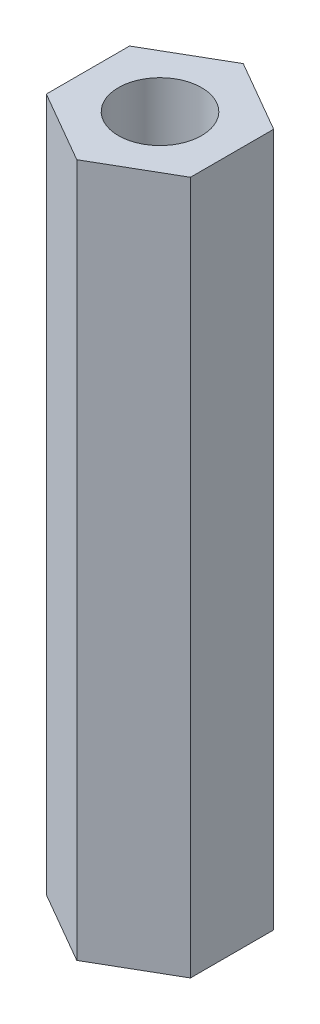
ISO-10303-21;
HEADER;
FILE_DESCRIPTION(('STEP AP214'),'2;1');
FILE_NAME('part.step','',(''),(''),'','','');
FILE_SCHEMA(('AUTOMOTIVE_DESIGN { 1 0 10303 214 1 1 1 1 }'));
ENDSEC;
DATA;
#1=APPLICATION_CONTEXT('core data for automotive mechanical design processes');
#2=APPLICATION_PROTOCOL_DEFINITION('international standard','automotive_design',2000,#1);
#3=PRODUCT_CONTEXT('',#1,'mechanical');
#4=PRODUCT('Part','Part','',(#3));
#5=PRODUCT_RELATED_PRODUCT_CATEGORY('part','',(#4));
#6=PRODUCT_DEFINITION_FORMATION('','',#4);
#7=PRODUCT_DEFINITION_CONTEXT('part definition',#1,'design');
#8=PRODUCT_DEFINITION('design','',#6,#7);
#9=PRODUCT_DEFINITION_SHAPE('','',#8);
#10=(LENGTH_UNIT() NAMED_UNIT(*) SI_UNIT(.MILLI.,.METRE.));
#11=(NAMED_UNIT(*) PLANE_ANGLE_UNIT() SI_UNIT($,.RADIAN.));
#12=(NAMED_UNIT(*) SI_UNIT($,.STERADIAN.) SOLID_ANGLE_UNIT());
#13=UNCERTAINTY_MEASURE_WITH_UNIT(LENGTH_MEASURE(1.E-05),#10,'distance_accuracy_value','');
#14=(GEOMETRIC_REPRESENTATION_CONTEXT(3) GLOBAL_UNCERTAINTY_ASSIGNED_CONTEXT((#13)) GLOBAL_UNIT_ASSIGNED_CONTEXT((#10,
#11,#12)) REPRESENTATION_CONTEXT('',''));
#15=CARTESIAN_POINT('',(0.,0.,0.));
#16=DIRECTION('',(0.,0.,1.));
#17=DIRECTION('',(1.,0.,0.));
#18=AXIS2_PLACEMENT_3D('',#15,#16,#17);
#19=CARTESIAN_POINT('',(0.,25.,0.));
#20=DIRECTION('',(0.,1.,0.));
#21=DIRECTION('',(0.,0.,1.));
#22=AXIS2_PLACEMENT_3D('',#19,#20,#21);
#23=PLANE('',#22);
#24=DIRECTION('',(-0.866025403784439,0.,-0.499999999999999));
#25=VECTOR('',#24,1.);
#26=CARTESIAN_POINT('',(2.59807621135331,25.,-1.50000000000001));
#27=LINE('',#26,#25);
#28=CARTESIAN_POINT('',(2.59807621135331,25.,-1.50000000000001));
#29=VERTEX_POINT('',#28);
#30=CARTESIAN_POINT('',(0.,25.,-3.));
#31=VERTEX_POINT('',#30);
#32=EDGE_CURVE('E130',#29,#31,#27,.T.);
#33=ORIENTED_EDGE('',*,*,#32,.T.);
#34=DIRECTION('',(-0.866025403784439,0.,0.499999999999999));
#35=VECTOR('',#34,1.);
#36=CARTESIAN_POINT('',(0.,25.,-3.));
#37=LINE('',#36,#35);
#38=CARTESIAN_POINT('',(-2.59807621135331,25.,-1.5));
#39=VERTEX_POINT('',#38);
#40=EDGE_CURVE('E88',#31,#39,#37,.T.);
#41=ORIENTED_EDGE('',*,*,#40,.T.);
#42=DIRECTION('',(0.,0.,1.));
#43=VECTOR('',#42,1.);
#44=CARTESIAN_POINT('',(-2.59807621135331,25.,-1.5));
#45=LINE('',#44,#43);
#46=CARTESIAN_POINT('',(-2.59807621135331,25.,1.50000000000001));
#47=VERTEX_POINT('',#46);
#48=EDGE_CURVE('E101',#39,#47,#45,.T.);
#49=ORIENTED_EDGE('',*,*,#48,.T.);
#50=DIRECTION('',(0.866025403784439,0.,0.499999999999999));
#51=VECTOR('',#50,1.);
#52=CARTESIAN_POINT('',(-2.59807621135331,25.,1.50000000000001));
#53=LINE('',#52,#51);
#54=CARTESIAN_POINT('',(0.,25.,3.));
#55=VERTEX_POINT('',#54);
#56=EDGE_CURVE('E95',#47,#55,#53,.T.);
#57=ORIENTED_EDGE('',*,*,#56,.T.);
#58=DIRECTION('',(0.866025403784439,0.,-0.499999999999999));
#59=VECTOR('',#58,1.);
#60=CARTESIAN_POINT('',(0.,25.,3.));
#61=LINE('',#60,#59);
#62=CARTESIAN_POINT('',(2.59807621135331,25.,1.5));
#63=VERTEX_POINT('',#62);
#64=EDGE_CURVE('E99',#55,#63,#61,.T.);
#65=ORIENTED_EDGE('',*,*,#64,.T.);
#66=DIRECTION('',(0.,0.,-1.));
#67=VECTOR('',#66,1.);
#68=CARTESIAN_POINT('',(2.59807621135331,25.,1.5));
#69=LINE('',#68,#67);
#70=EDGE_CURVE('E51',#63,#29,#69,.T.);
#71=ORIENTED_EDGE('',*,*,#70,.T.);
#72=EDGE_LOOP('',(#33,#41,#49,#57,#65,#71));
#73=FACE_BOUND('',#72,.T.);
#74=CARTESIAN_POINT('',(0.,25.,0.));
#75=DIRECTION('',(0.,1.,0.));
#76=DIRECTION('',(0.,0.,1.));
#77=AXIS2_PLACEMENT_3D('',#74,#75,#76);
#78=CIRCLE('',#77,1.5);
#79=CARTESIAN_POINT('',(0.,25.,1.5));
#80=VERTEX_POINT('',#79);
#81=EDGE_CURVE('E123',#80,#80,#78,.T.);
#82=ORIENTED_EDGE('',*,*,#81,.F.);
#83=EDGE_LOOP('',(#82));
#84=FACE_BOUND('',#83,.T.);
#85=ADVANCED_FACE('F34',(#73,#84),#23,.T.);
#86=CARTESIAN_POINT('',(0.,0.,0.));
#87=DIRECTION('',(0.,1.,0.));
#88=DIRECTION('',(0.,0.,1.));
#89=AXIS2_PLACEMENT_3D('',#86,#87,#88);
#90=PLANE('',#89);
#91=DIRECTION('',(-0.866025403784439,0.,-0.499999999999999));
#92=VECTOR('',#91,1.);
#93=CARTESIAN_POINT('',(2.59807621135331,0.,-1.50000000000001));
#94=LINE('',#93,#92);
#95=CARTESIAN_POINT('',(2.59807621135331,0.,-1.50000000000001));
#96=VERTEX_POINT('',#95);
#97=CARTESIAN_POINT('',(0.,0.,-3.));
#98=VERTEX_POINT('',#97);
#99=EDGE_CURVE('E119',#96,#98,#94,.T.);
#100=ORIENTED_EDGE('',*,*,#99,.F.);
#101=DIRECTION('',(0.,0.,-1.));
#102=VECTOR('',#101,1.);
#103=CARTESIAN_POINT('',(2.59807621135331,0.,1.5));
#104=LINE('',#103,#102);
#105=CARTESIAN_POINT('',(2.59807621135331,0.,1.5));
#106=VERTEX_POINT('',#105);
#107=EDGE_CURVE('E80',#106,#96,#104,.T.);
#108=ORIENTED_EDGE('',*,*,#107,.F.);
#109=DIRECTION('',(0.866025403784439,0.,-0.499999999999999));
#110=VECTOR('',#109,1.);
#111=CARTESIAN_POINT('',(0.,0.,3.));
#112=LINE('',#111,#110);
#113=CARTESIAN_POINT('',(0.,0.,3.));
#114=VERTEX_POINT('',#113);
#115=EDGE_CURVE('E74',#114,#106,#112,.T.);
#116=ORIENTED_EDGE('',*,*,#115,.F.);
#117=DIRECTION('',(0.866025403784439,0.,0.499999999999999));
#118=VECTOR('',#117,1.);
#119=CARTESIAN_POINT('',(-2.59807621135331,0.,1.50000000000001));
#120=LINE('',#119,#118);
#121=CARTESIAN_POINT('',(-2.59807621135331,0.,1.50000000000001));
#122=VERTEX_POINT('',#121);
#123=EDGE_CURVE('E109',#122,#114,#120,.T.);
#124=ORIENTED_EDGE('',*,*,#123,.F.);
#125=DIRECTION('',(0.,0.,1.));
#126=VECTOR('',#125,1.);
#127=CARTESIAN_POINT('',(-2.59807621135331,0.,-1.5));
#128=LINE('',#127,#126);
#129=CARTESIAN_POINT('',(-2.59807621135331,0.,-1.5));
#130=VERTEX_POINT('',#129);
#131=EDGE_CURVE('E125',#130,#122,#128,.T.);
#132=ORIENTED_EDGE('',*,*,#131,.F.);
#133=DIRECTION('',(-0.866025403784439,0.,0.499999999999999));
#134=VECTOR('',#133,1.);
#135=CARTESIAN_POINT('',(0.,0.,-3.));
#136=LINE('',#135,#134);
#137=EDGE_CURVE('E122',#98,#130,#136,.T.);
#138=ORIENTED_EDGE('',*,*,#137,.F.);
#139=EDGE_LOOP('',(#100,#108,#116,#124,#132,#138));
#140=FACE_BOUND('',#139,.T.);
#141=CARTESIAN_POINT('',(0.,0.,0.));
#142=DIRECTION('',(0.,1.,0.));
#143=DIRECTION('',(0.,0.,1.));
#144=AXIS2_PLACEMENT_3D('',#141,#142,#143);
#145=CIRCLE('',#144,1.5);
#146=CARTESIAN_POINT('',(0.,0.,1.5));
#147=VERTEX_POINT('',#146);
#148=EDGE_CURVE('E223',#147,#147,#145,.T.);
#149=ORIENTED_EDGE('',*,*,#148,.T.);
#150=EDGE_LOOP('',(#149));
#151=FACE_BOUND('',#150,.T.);
#152=ADVANCED_FACE('F139',(#140,#151),#90,.F.);
#153=CARTESIAN_POINT('',(2.59807621135331,25.,-1.50000000000001));
#154=DIRECTION('',(-0.499999999999999,0.,0.866025403784439));
#155=DIRECTION('',(0.866025403784439,0.,0.499999999999999));
#156=AXIS2_PLACEMENT_3D('',#153,#154,#155);
#157=PLANE('',#156);
#158=ORIENTED_EDGE('',*,*,#99,.T.);
#159=DIRECTION('',(0.,-1.,0.));
#160=VECTOR('',#159,1.);
#161=CARTESIAN_POINT('',(0.,25.,-3.));
#162=LINE('',#161,#160);
#163=EDGE_CURVE('E11',#31,#98,#162,.T.);
#164=ORIENTED_EDGE('',*,*,#163,.F.);
#165=ORIENTED_EDGE('',*,*,#32,.F.);
#166=DIRECTION('',(0.,-1.,0.));
#167=VECTOR('',#166,1.);
#168=CARTESIAN_POINT('',(2.59807621135331,25.,-1.50000000000001));
#169=LINE('',#168,#167);
#170=EDGE_CURVE('E115',#29,#96,#169,.T.);
#171=ORIENTED_EDGE('',*,*,#170,.T.);
#172=EDGE_LOOP('',(#158,#164,#165,#171));
#173=FACE_BOUND('',#172,.T.);
#174=ADVANCED_FACE('F36',(#173),#157,.F.);
#175=CARTESIAN_POINT('',(0.,25.,-3.));
#176=DIRECTION('',(0.499999999999999,0.,0.866025403784439));
#177=DIRECTION('',(0.866025403784439,0.,-0.499999999999999));
#178=AXIS2_PLACEMENT_3D('',#175,#176,#177);
#179=PLANE('',#178);
#180=ORIENTED_EDGE('',*,*,#137,.T.);
#181=DIRECTION('',(0.,-1.,0.));
#182=VECTOR('',#181,1.);
#183=CARTESIAN_POINT('',(-2.59807621135331,25.,-1.5));
#184=LINE('',#183,#182);
#185=EDGE_CURVE('E43',#39,#130,#184,.T.);
#186=ORIENTED_EDGE('',*,*,#185,.F.);
#187=ORIENTED_EDGE('',*,*,#40,.F.);
#188=ORIENTED_EDGE('',*,*,#163,.T.);
#189=EDGE_LOOP('',(#180,#186,#187,#188));
#190=FACE_BOUND('',#189,.T.);
#191=ADVANCED_FACE('F164',(#190),#179,.F.);
#192=CARTESIAN_POINT('',(-2.59807621135331,25.,-1.5));
#193=DIRECTION('',(1.,0.,0.));
#194=DIRECTION('',(0.,0.,-1.));
#195=AXIS2_PLACEMENT_3D('',#192,#193,#194);
#196=PLANE('',#195);
#197=ORIENTED_EDGE('',*,*,#131,.T.);
#198=DIRECTION('',(0.,-1.,0.));
#199=VECTOR('',#198,1.);
#200=CARTESIAN_POINT('',(-2.59807621135331,25.,1.50000000000001));
#201=LINE('',#200,#199);
#202=EDGE_CURVE('E110',#47,#122,#201,.T.);
#203=ORIENTED_EDGE('',*,*,#202,.F.);
#204=ORIENTED_EDGE('',*,*,#48,.F.);
#205=ORIENTED_EDGE('',*,*,#185,.T.);
#206=EDGE_LOOP('',(#197,#203,#204,#205));
#207=FACE_BOUND('',#206,.T.);
#208=ADVANCED_FACE('F136',(#207),#196,.F.);
#209=CARTESIAN_POINT('',(-2.59807621135331,25.,1.50000000000001));
#210=DIRECTION('',(0.499999999999999,0.,-0.866025403784439));
#211=DIRECTION('',(-0.866025403784439,0.,-0.499999999999999));
#212=AXIS2_PLACEMENT_3D('',#209,#210,#211);
#213=PLANE('',#212);
#214=ORIENTED_EDGE('',*,*,#123,.T.);
#215=DIRECTION('',(0.,-1.,0.));
#216=VECTOR('',#215,1.);
#217=CARTESIAN_POINT('',(0.,25.,3.));
#218=LINE('',#217,#216);
#219=EDGE_CURVE('E106',#55,#114,#218,.T.);
#220=ORIENTED_EDGE('',*,*,#219,.F.);
#221=ORIENTED_EDGE('',*,*,#56,.F.);
#222=ORIENTED_EDGE('',*,*,#202,.T.);
#223=EDGE_LOOP('',(#214,#220,#221,#222));
#224=FACE_BOUND('',#223,.T.);
#225=ADVANCED_FACE('F107',(#224),#213,.F.);
#226=CARTESIAN_POINT('',(0.,25.,3.));
#227=DIRECTION('',(-0.499999999999999,0.,-0.866025403784439));
#228=DIRECTION('',(-0.866025403784439,0.,0.499999999999999));
#229=AXIS2_PLACEMENT_3D('',#226,#227,#228);
#230=PLANE('',#229);
#231=ORIENTED_EDGE('',*,*,#115,.T.);
#232=DIRECTION('',(0.,-1.,0.));
#233=VECTOR('',#232,1.);
#234=CARTESIAN_POINT('',(2.59807621135331,25.,1.5));
#235=LINE('',#234,#233);
#236=EDGE_CURVE('E111',#63,#106,#235,.T.);
#237=ORIENTED_EDGE('',*,*,#236,.F.);
#238=ORIENTED_EDGE('',*,*,#64,.F.);
#239=ORIENTED_EDGE('',*,*,#219,.T.);
#240=EDGE_LOOP('',(#231,#237,#238,#239));
#241=FACE_BOUND('',#240,.T.);
#242=ADVANCED_FACE('F113',(#241),#230,.F.);
#243=CARTESIAN_POINT('',(2.59807621135331,25.,1.5));
#244=DIRECTION('',(-1.,0.,0.));
#245=DIRECTION('',(0.,0.,1.));
#246=AXIS2_PLACEMENT_3D('',#243,#244,#245);
#247=PLANE('',#246);
#248=ORIENTED_EDGE('',*,*,#107,.T.);
#249=ORIENTED_EDGE('',*,*,#170,.F.);
#250=ORIENTED_EDGE('',*,*,#70,.F.);
#251=ORIENTED_EDGE('',*,*,#236,.T.);
#252=EDGE_LOOP('',(#248,#249,#250,#251));
#253=FACE_BOUND('',#252,.T.);
#254=ADVANCED_FACE('F144',(#253),#247,.F.);
#255=CARTESIAN_POINT('',(0.,25.,0.));
#256=DIRECTION('',(0.,-1.,0.));
#257=DIRECTION('',(0.,0.,-1.));
#258=AXIS2_PLACEMENT_3D('',#255,#256,#257);
#259=CYLINDRICAL_SURFACE('',#258,1.5);
#260=ORIENTED_EDGE('',*,*,#81,.T.);
#261=EDGE_LOOP('',(#260));
#262=FACE_BOUND('',#261,.T.);
#263=ORIENTED_EDGE('',*,*,#148,.F.);
#264=EDGE_LOOP('',(#263));
#265=FACE_BOUND('',#264,.T.);
#266=ADVANCED_FACE('F146',(#262,#265),#259,.F.);
#267=CLOSED_SHELL('',(#85,#152,#174,#191,#208,#225,#242,#254,#266));
#268=MANIFOLD_SOLID_BREP('B2',#267);
#269=ADVANCED_BREP_SHAPE_REPRESENTATION('',(#18,#268),#14);
#270=SHAPE_DEFINITION_REPRESENTATION(#9,#269);
ENDSEC;
END-ISO-10303-21;
